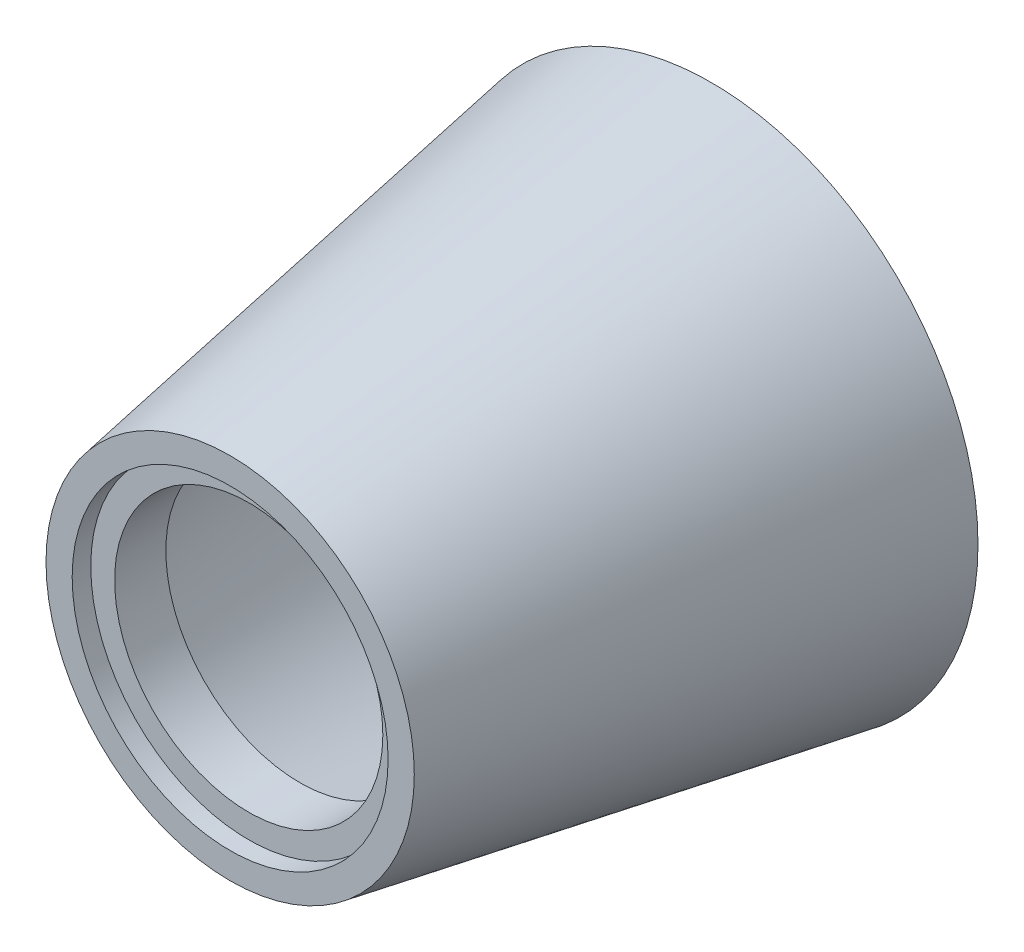
ISO-10303-21;
HEADER;
FILE_DESCRIPTION(('STEP AP214'),'2;1');
FILE_NAME('part.step','',(''),(''),'','','');
FILE_SCHEMA(('AUTOMOTIVE_DESIGN { 1 0 10303 214 1 1 1 1 }'));
ENDSEC;
DATA;
#1=APPLICATION_CONTEXT('core data for automotive mechanical design processes');
#2=APPLICATION_PROTOCOL_DEFINITION('international standard','automotive_design',2000,#1);
#3=PRODUCT_CONTEXT('',#1,'mechanical');
#4=PRODUCT('Part','Part','',(#3));
#5=PRODUCT_RELATED_PRODUCT_CATEGORY('part','',(#4));
#6=PRODUCT_DEFINITION_FORMATION('','',#4);
#7=PRODUCT_DEFINITION_CONTEXT('part definition',#1,'design');
#8=PRODUCT_DEFINITION('design','',#6,#7);
#9=PRODUCT_DEFINITION_SHAPE('','',#8);
#10=(LENGTH_UNIT() NAMED_UNIT(*) SI_UNIT(.MILLI.,.METRE.));
#11=(NAMED_UNIT(*) PLANE_ANGLE_UNIT() SI_UNIT($,.RADIAN.));
#12=(NAMED_UNIT(*) SI_UNIT($,.STERADIAN.) SOLID_ANGLE_UNIT());
#13=UNCERTAINTY_MEASURE_WITH_UNIT(LENGTH_MEASURE(1.E-05),#10,'distance_accuracy_value','');
#14=(GEOMETRIC_REPRESENTATION_CONTEXT(3) GLOBAL_UNCERTAINTY_ASSIGNED_CONTEXT((#13)) GLOBAL_UNIT_ASSIGNED_CONTEXT((#10,
#11,#12)) REPRESENTATION_CONTEXT('',''));
#15=CARTESIAN_POINT('',(0.,0.,0.));
#16=DIRECTION('',(0.,0.,1.));
#17=DIRECTION('',(1.,0.,0.));
#18=AXIS2_PLACEMENT_3D('',#15,#16,#17);
#19=CARTESIAN_POINT('',(0.,0.,108.406367075473));
#20=DIRECTION('',(0.,0.,1.));
#21=DIRECTION('',(1.,0.,0.));
#22=AXIS2_PLACEMENT_3D('',#19,#20,#21);
#23=CYLINDRICAL_SURFACE('',#22,72.1588454641685);
#24=CARTESIAN_POINT('',(0.,0.,47.2427889610074));
#25=DIRECTION('',(0.,0.,1.));
#26=DIRECTION('',(1.,0.,0.));
#27=AXIS2_PLACEMENT_3D('',#24,#25,#26);
#28=CIRCLE('',#27,72.1588454641685);
#29=CARTESIAN_POINT('',(72.1588454641685,0.,47.2427889610074));
#30=VERTEX_POINT('',#29);
#31=EDGE_CURVE('E78',#30,#30,#28,.T.);
#32=ORIENTED_EDGE('',*,*,#31,.F.);
#33=EDGE_LOOP('',(#32));
#34=FACE_BOUND('',#33,.T.);
#35=CARTESIAN_POINT('',(0.,0.,74.7957587899811));
#36=DIRECTION('',(0.,0.,1.));
#37=DIRECTION('',(1.,0.,0.));
#38=AXIS2_PLACEMENT_3D('',#35,#36,#37);
#39=CIRCLE('',#38,72.1588454641685);
#40=CARTESIAN_POINT('',(72.1588454641685,0.,74.7957587899811));
#41=VERTEX_POINT('',#40);
#42=EDGE_CURVE('E10',#41,#41,#39,.T.);
#43=ORIENTED_EDGE('',*,*,#42,.T.);
#44=EDGE_LOOP('',(#43));
#45=FACE_BOUND('',#44,.T.);
#46=ADVANCED_FACE('F43',(#34,#45),#23,.F.);
#47=CARTESIAN_POINT('',(0.,72.1588454641685,74.7957587899811));
#48=DIRECTION('',(0.,0.,-1.));
#49=DIRECTION('',(-1.,0.,0.));
#50=AXIS2_PLACEMENT_3D('',#47,#48,#49);
#51=PLANE('',#50);
#52=ORIENTED_EDGE('',*,*,#42,.F.);
#53=EDGE_LOOP('',(#52));
#54=FACE_BOUND('',#53,.T.);
#55=CARTESIAN_POINT('',(0.,0.,74.7957587899811));
#56=DIRECTION('',(0.,0.,1.));
#57=DIRECTION('',(1.,0.,0.));
#58=AXIS2_PLACEMENT_3D('',#55,#56,#57);
#59=CIRCLE('',#58,85.);
#60=CARTESIAN_POINT('',(85.,0.,74.7957587899811));
#61=VERTEX_POINT('',#60);
#62=EDGE_CURVE('E50',#61,#61,#59,.T.);
#63=ORIENTED_EDGE('',*,*,#62,.T.);
#64=EDGE_LOOP('',(#63));
#65=FACE_BOUND('',#64,.T.);
#66=ADVANCED_FACE('F86',(#54,#65),#51,.F.);
#67=CARTESIAN_POINT('',(0.,0.,108.406367075473));
#68=DIRECTION('',(0.,0.,1.));
#69=DIRECTION('',(1.,0.,0.));
#70=AXIS2_PLACEMENT_3D('',#67,#68,#69);
#71=CYLINDRICAL_SURFACE('',#70,85.);
#72=ORIENTED_EDGE('',*,*,#62,.F.);
#73=EDGE_LOOP('',(#72));
#74=FACE_BOUND('',#73,.T.);
#75=CARTESIAN_POINT('',(0.,0.,84.7957587899811));
#76=DIRECTION('',(0.,0.,1.));
#77=DIRECTION('',(1.,0.,0.));
#78=AXIS2_PLACEMENT_3D('',#75,#76,#77);
#79=CIRCLE('',#78,85.);
#80=CARTESIAN_POINT('',(85.,0.,84.7957587899811));
#81=VERTEX_POINT('',#80);
#82=EDGE_CURVE('E55',#81,#81,#79,.T.);
#83=ORIENTED_EDGE('',*,*,#82,.T.);
#84=EDGE_LOOP('',(#83));
#85=FACE_BOUND('',#84,.T.);
#86=ADVANCED_FACE('F90',(#74,#85),#71,.F.);
#87=CARTESIAN_POINT('',(0.,85.,84.7957587899811));
#88=DIRECTION('',(0.,0.,-1.));
#89=DIRECTION('',(-1.,0.,0.));
#90=AXIS2_PLACEMENT_3D('',#87,#88,#89);
#91=PLANE('',#90);
#92=ORIENTED_EDGE('',*,*,#82,.F.);
#93=EDGE_LOOP('',(#92));
#94=FACE_BOUND('',#93,.T.);
#95=CARTESIAN_POINT('',(0.,0.,84.7957587899811));
#96=DIRECTION('',(0.,0.,1.));
#97=DIRECTION('',(1.,0.,0.));
#98=AXIS2_PLACEMENT_3D('',#95,#96,#97);
#99=CIRCLE('',#98,99.0835893857904);
#100=CARTESIAN_POINT('',(99.0835893857904,0.,84.7957587899811));
#101=VERTEX_POINT('',#100);
#102=EDGE_CURVE('E60',#101,#101,#99,.T.);
#103=ORIENTED_EDGE('',*,*,#102,.T.);
#104=EDGE_LOOP('',(#103));
#105=FACE_BOUND('',#104,.T.);
#106=ADVANCED_FACE('F95',(#94,#105),#91,.F.);
#107=CARTESIAN_POINT('',(0.,0.,-174.114088383152));
#108=DIRECTION('',(0.,0.,-1.));
#109=DIRECTION('',(-1.,0.,0.));
#110=AXIS2_PLACEMENT_3D('',#107,#108,#109);
#111=CONICAL_SURFACE('',#110,143.490018022482,0.169860381171282);
#112=ORIENTED_EDGE('',*,*,#102,.F.);
#113=EDGE_LOOP('',(#112));
#114=FACE_BOUND('',#113,.T.);
#115=CARTESIAN_POINT('',(0.,0.,-174.114088383152));
#116=DIRECTION('',(0.,0.,1.));
#117=DIRECTION('',(1.,0.,0.));
#118=AXIS2_PLACEMENT_3D('',#115,#116,#117);
#119=CIRCLE('',#118,143.490018022482);
#120=CARTESIAN_POINT('',(143.490018022482,0.,-174.114088383152));
#121=VERTEX_POINT('',#120);
#122=EDGE_CURVE('E66',#121,#121,#119,.T.);
#123=ORIENTED_EDGE('',*,*,#122,.T.);
#124=EDGE_LOOP('',(#123));
#125=FACE_BOUND('',#124,.T.);
#126=ADVANCED_FACE('F101',(#114,#125),#111,.T.);
#127=CARTESIAN_POINT('',(0.,143.490018022482,-174.114088383152));
#128=DIRECTION('',(0.,0.,1.));
#129=DIRECTION('',(1.,0.,0.));
#130=AXIS2_PLACEMENT_3D('',#127,#128,#129);
#131=PLANE('',#130);
#132=ORIENTED_EDGE('',*,*,#122,.F.);
#133=EDGE_LOOP('',(#132));
#134=FACE_BOUND('',#133,.T.);
#135=CARTESIAN_POINT('',(0.,0.,-174.114088383152));
#136=DIRECTION('',(0.,0.,1.));
#137=DIRECTION('',(1.,0.,0.));
#138=AXIS2_PLACEMENT_3D('',#135,#136,#137);
#139=CIRCLE('',#138,121.286803704136);
#140=CARTESIAN_POINT('',(121.286803704136,0.,-174.114088383152));
#141=VERTEX_POINT('',#140);
#142=EDGE_CURVE('E70',#141,#141,#139,.T.);
#143=ORIENTED_EDGE('',*,*,#142,.T.);
#144=EDGE_LOOP('',(#143));
#145=FACE_BOUND('',#144,.T.);
#146=ADVANCED_FACE('F105',(#134,#145),#131,.F.);
#147=CARTESIAN_POINT('',(0.,0.,47.2427889610074));
#148=DIRECTION('',(0.,0.,-1.));
#149=DIRECTION('',(-1.,0.,0.));
#150=AXIS2_PLACEMENT_3D('',#147,#148,#149);
#151=CONICAL_SURFACE('',#150,83.3212010654261,0.169860381171282);
#152=ORIENTED_EDGE('',*,*,#142,.F.);
#153=EDGE_LOOP('',(#152));
#154=FACE_BOUND('',#153,.T.);
#155=CARTESIAN_POINT('',(0.,0.,47.2427889610074));
#156=DIRECTION('',(0.,0.,1.));
#157=DIRECTION('',(1.,0.,0.));
#158=AXIS2_PLACEMENT_3D('',#155,#156,#157);
#159=CIRCLE('',#158,83.3212010654261);
#160=CARTESIAN_POINT('',(83.3212010654261,0.,47.2427889610074));
#161=VERTEX_POINT('',#160);
#162=EDGE_CURVE('E74',#161,#161,#159,.T.);
#163=ORIENTED_EDGE('',*,*,#162,.T.);
#164=EDGE_LOOP('',(#163));
#165=FACE_BOUND('',#164,.T.);
#166=ADVANCED_FACE('F109',(#154,#165),#151,.F.);
#167=CARTESIAN_POINT('',(0.,83.3212010654261,47.2427889610074));
#168=DIRECTION('',(0.,0.,1.));
#169=DIRECTION('',(1.,0.,0.));
#170=AXIS2_PLACEMENT_3D('',#167,#168,#169);
#171=PLANE('',#170);
#172=ORIENTED_EDGE('',*,*,#162,.F.);
#173=EDGE_LOOP('',(#172));
#174=FACE_BOUND('',#173,.T.);
#175=ORIENTED_EDGE('',*,*,#31,.T.);
#176=EDGE_LOOP('',(#175));
#177=FACE_BOUND('',#176,.T.);
#178=ADVANCED_FACE('F83',(#174,#177),#171,.F.);
#179=CLOSED_SHELL('',(#46,#66,#86,#106,#126,#146,#166,#178));
#180=MANIFOLD_SOLID_BREP('B2',#179);
#181=ADVANCED_BREP_SHAPE_REPRESENTATION('',(#18,#180),#14);
#182=SHAPE_DEFINITION_REPRESENTATION(#9,#181);
ENDSEC;
END-ISO-10303-21;
